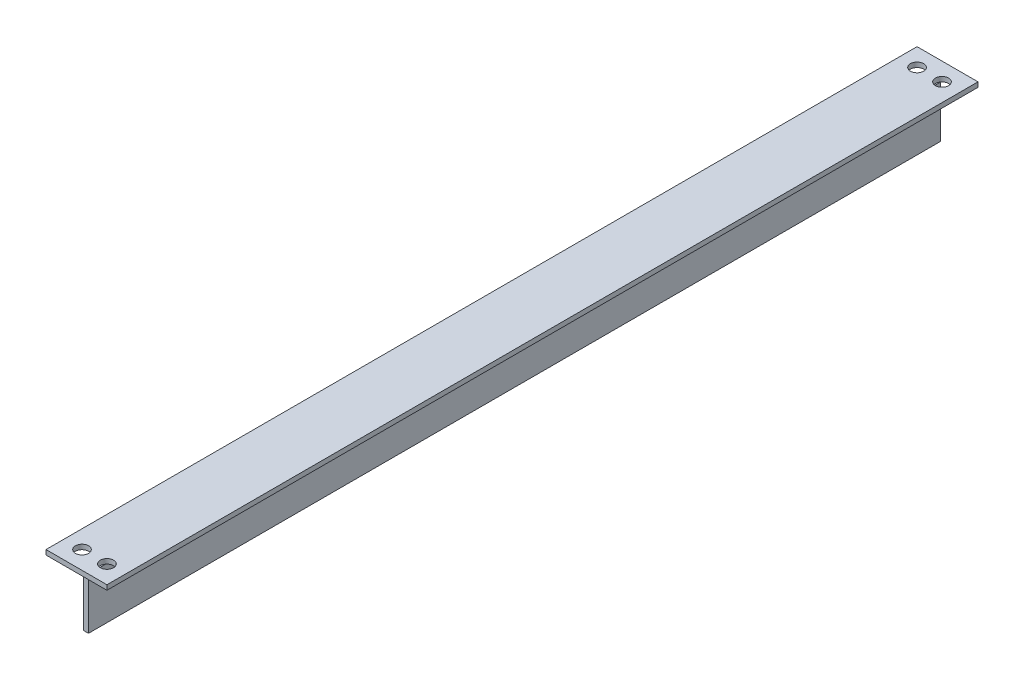
ISO-10303-21;
HEADER;
FILE_DESCRIPTION(('STEP AP214'),'2;1');
FILE_NAME('part.step','',(''),(''),'','','');
FILE_SCHEMA(('AUTOMOTIVE_DESIGN { 1 0 10303 214 1 1 1 1 }'));
ENDSEC;
DATA;
#1=APPLICATION_CONTEXT('core data for automotive mechanical design processes');
#2=APPLICATION_PROTOCOL_DEFINITION('international standard','automotive_design',2000,#1);
#3=PRODUCT_CONTEXT('',#1,'mechanical');
#4=PRODUCT('Part','Part','',(#3));
#5=PRODUCT_RELATED_PRODUCT_CATEGORY('part','',(#4));
#6=PRODUCT_DEFINITION_FORMATION('','',#4);
#7=PRODUCT_DEFINITION_CONTEXT('part definition',#1,'design');
#8=PRODUCT_DEFINITION('design','',#6,#7);
#9=PRODUCT_DEFINITION_SHAPE('','',#8);
#10=(LENGTH_UNIT() NAMED_UNIT(*) SI_UNIT(.MILLI.,.METRE.));
#11=(NAMED_UNIT(*) PLANE_ANGLE_UNIT() SI_UNIT($,.RADIAN.));
#12=(NAMED_UNIT(*) SI_UNIT($,.STERADIAN.) SOLID_ANGLE_UNIT());
#13=UNCERTAINTY_MEASURE_WITH_UNIT(LENGTH_MEASURE(1.E-05),#10,'distance_accuracy_value','');
#14=(GEOMETRIC_REPRESENTATION_CONTEXT(3) GLOBAL_UNCERTAINTY_ASSIGNED_CONTEXT((#13)) GLOBAL_UNIT_ASSIGNED_CONTEXT((#10,
#11,#12)) REPRESENTATION_CONTEXT('',''));
#15=CARTESIAN_POINT('',(0.,0.,0.));
#16=DIRECTION('',(0.,0.,1.));
#17=DIRECTION('',(1.,0.,0.));
#18=AXIS2_PLACEMENT_3D('',#15,#16,#17);
#19=CARTESIAN_POINT('',(-1.,-1.99999999999999,181.5));
#20=DIRECTION('',(1.,0.,0.));
#21=DIRECTION('',(0.,1.,0.));
#22=AXIS2_PLACEMENT_3D('',#19,#20,#21);
#23=PLANE('',#22);
#24=DIRECTION('',(0.,0.,-1.));
#25=VECTOR('',#24,1.);
#26=CARTESIAN_POINT('',(-1.,-3.99999999999999,181.5));
#27=LINE('',#26,#25);
#28=CARTESIAN_POINT('',(-1.,-3.99999999999999,177.5));
#29=VERTEX_POINT('',#28);
#30=CARTESIAN_POINT('',(-1.,-3.99999999999999,168.));
#31=VERTEX_POINT('',#30);
#32=EDGE_CURVE('E202',#29,#31,#27,.T.);
#33=ORIENTED_EDGE('',*,*,#32,.T.);
#34=DIRECTION('',(0.,1.,0.));
#35=VECTOR('',#34,1.);
#36=CARTESIAN_POINT('',(-1.,-1.99999999999999,168.));
#37=LINE('',#36,#35);
#38=CARTESIAN_POINT('',(-1.,-1.99999999999999,168.));
#39=VERTEX_POINT('',#38);
#40=EDGE_CURVE('E155',#31,#39,#37,.T.);
#41=ORIENTED_EDGE('',*,*,#40,.T.);
#42=DIRECTION('',(0.,0.,-1.));
#43=VECTOR('',#42,1.);
#44=CARTESIAN_POINT('',(-1.,-1.99999999999999,181.5));
#45=LINE('',#44,#43);
#46=CARTESIAN_POINT('',(-1.,-1.99999999999999,-168.));
#47=VERTEX_POINT('',#46);
#48=EDGE_CURVE('E149',#39,#47,#45,.T.);
#49=ORIENTED_EDGE('',*,*,#48,.T.);
#50=DIRECTION('',(0.,-1.,0.));
#51=VECTOR('',#50,1.);
#52=CARTESIAN_POINT('',(-1.,-1.99999999999999,-168.));
#53=LINE('',#52,#51);
#54=CARTESIAN_POINT('',(-1.,-3.99999999999999,-168.));
#55=VERTEX_POINT('',#54);
#56=EDGE_CURVE('E131',#47,#55,#53,.T.);
#57=ORIENTED_EDGE('',*,*,#56,.T.);
#58=DIRECTION('',(0.,0.,-1.));
#59=VECTOR('',#58,1.);
#60=CARTESIAN_POINT('',(-1.,-3.99999999999999,181.5));
#61=LINE('',#60,#59);
#62=CARTESIAN_POINT('',(-1.,-3.99999999999999,-177.5));
#63=VERTEX_POINT('',#62);
#64=EDGE_CURVE('E216',#55,#63,#61,.T.);
#65=ORIENTED_EDGE('',*,*,#64,.T.);
#66=DIRECTION('',(0.,-1.,0.));
#67=VECTOR('',#66,1.);
#68=CARTESIAN_POINT('',(-1.,-1.99999999999999,-177.5));
#69=LINE('',#68,#67);
#70=CARTESIAN_POINT('',(-0.999999999999994,-25.4,-177.5));
#71=VERTEX_POINT('',#70);
#72=EDGE_CURVE('E213',#63,#71,#69,.T.);
#73=ORIENTED_EDGE('',*,*,#72,.T.);
#74=DIRECTION('',(0.,0.,-1.));
#75=VECTOR('',#74,1.);
#76=CARTESIAN_POINT('',(-0.999999999999997,-25.4,181.5));
#77=LINE('',#76,#75);
#78=CARTESIAN_POINT('',(-0.999999999999994,-25.4,177.5));
#79=VERTEX_POINT('',#78);
#80=EDGE_CURVE('E157',#79,#71,#77,.T.);
#81=ORIENTED_EDGE('',*,*,#80,.F.);
#82=DIRECTION('',(0.,1.,0.));
#83=VECTOR('',#82,1.);
#84=CARTESIAN_POINT('',(-1.,-1.99999999999999,177.5));
#85=LINE('',#84,#83);
#86=EDGE_CURVE('E210',#79,#29,#85,.T.);
#87=ORIENTED_EDGE('',*,*,#86,.T.);
#88=EDGE_LOOP('',(#33,#41,#49,#57,#65,#73,#81,#87));
#89=FACE_BOUND('',#88,.T.);
#90=ADVANCED_FACE('F33',(#89),#23,.F.);
#91=CARTESIAN_POINT('',(-0.999999999999997,-25.4,181.5));
#92=DIRECTION('',(0.,1.,0.));
#93=DIRECTION('',(0.,0.,1.));
#94=AXIS2_PLACEMENT_3D('',#91,#92,#93);
#95=PLANE('',#94);
#96=DIRECTION('',(0.,0.,-1.));
#97=VECTOR('',#96,1.);
#98=CARTESIAN_POINT('',(0.999999999999997,-25.4,181.5));
#99=LINE('',#98,#97);
#100=CARTESIAN_POINT('',(0.999999999999994,-25.4,177.5));
#101=VERTEX_POINT('',#100);
#102=CARTESIAN_POINT('',(1.,-25.4,-177.5));
#103=VERTEX_POINT('',#102);
#104=EDGE_CURVE('E163',#101,#103,#99,.T.);
#105=ORIENTED_EDGE('',*,*,#104,.F.);
#106=DIRECTION('',(1.,0.,0.));
#107=VECTOR('',#106,1.);
#108=CARTESIAN_POINT('',(-50.,-25.4,177.5));
#109=LINE('',#108,#107);
#110=EDGE_CURVE('E182',#79,#101,#109,.T.);
#111=ORIENTED_EDGE('',*,*,#110,.F.);
#112=ORIENTED_EDGE('',*,*,#80,.T.);
#113=DIRECTION('',(1.,0.,0.));
#114=VECTOR('',#113,1.);
#115=CARTESIAN_POINT('',(-50.,-25.4,-177.5));
#116=LINE('',#115,#114);
#117=EDGE_CURVE('E184',#71,#103,#116,.T.);
#118=ORIENTED_EDGE('',*,*,#117,.T.);
#119=EDGE_LOOP('',(#105,#111,#112,#118));
#120=FACE_BOUND('',#119,.T.);
#121=ADVANCED_FACE('F181',(#120),#95,.F.);
#122=CARTESIAN_POINT('',(1.,-1.99999999999999,181.5));
#123=DIRECTION('',(-1.,0.,0.));
#124=DIRECTION('',(0.,-1.,0.));
#125=AXIS2_PLACEMENT_3D('',#122,#123,#124);
#126=PLANE('',#125);
#127=DIRECTION('',(0.,0.,-1.));
#128=VECTOR('',#127,1.);
#129=CARTESIAN_POINT('',(1.,-1.99999999999999,181.5));
#130=LINE('',#129,#128);
#131=CARTESIAN_POINT('',(1.,-1.99999999999999,168.));
#132=VERTEX_POINT('',#131);
#133=CARTESIAN_POINT('',(1.,-1.99999999999999,-168.));
#134=VERTEX_POINT('',#133);
#135=EDGE_CURVE('E151',#132,#134,#130,.T.);
#136=ORIENTED_EDGE('',*,*,#135,.F.);
#137=DIRECTION('',(0.,-1.,0.));
#138=VECTOR('',#137,1.);
#139=CARTESIAN_POINT('',(1.,-1.99999999999999,168.));
#140=LINE('',#139,#138);
#141=CARTESIAN_POINT('',(1.,-3.99999999999999,168.));
#142=VERTEX_POINT('',#141);
#143=EDGE_CURVE('E141',#132,#142,#140,.T.);
#144=ORIENTED_EDGE('',*,*,#143,.T.);
#145=DIRECTION('',(0.,0.,1.));
#146=VECTOR('',#145,1.);
#147=CARTESIAN_POINT('',(1.,-3.99999999999999,181.5));
#148=LINE('',#147,#146);
#149=CARTESIAN_POINT('',(1.,-3.99999999999999,177.5));
#150=VERTEX_POINT('',#149);
#151=EDGE_CURVE('E11',#142,#150,#148,.T.);
#152=ORIENTED_EDGE('',*,*,#151,.T.);
#153=DIRECTION('',(0.,-1.,0.));
#154=VECTOR('',#153,1.);
#155=CARTESIAN_POINT('',(1.,-1.99999999999999,177.5));
#156=LINE('',#155,#154);
#157=EDGE_CURVE('E42',#150,#101,#156,.T.);
#158=ORIENTED_EDGE('',*,*,#157,.T.);
#159=ORIENTED_EDGE('',*,*,#104,.T.);
#160=DIRECTION('',(0.,1.,0.));
#161=VECTOR('',#160,1.);
#162=CARTESIAN_POINT('',(1.,-1.99999999999999,-177.5));
#163=LINE('',#162,#161);
#164=CARTESIAN_POINT('',(1.,-3.99999999999999,-177.5));
#165=VERTEX_POINT('',#164);
#166=EDGE_CURVE('E160',#103,#165,#163,.T.);
#167=ORIENTED_EDGE('',*,*,#166,.T.);
#168=DIRECTION('',(0.,0.,1.));
#169=VECTOR('',#168,1.);
#170=CARTESIAN_POINT('',(1.,-3.99999999999999,181.5));
#171=LINE('',#170,#169);
#172=CARTESIAN_POINT('',(1.,-3.99999999999999,-168.));
#173=VERTEX_POINT('',#172);
#174=EDGE_CURVE('E156',#165,#173,#171,.T.);
#175=ORIENTED_EDGE('',*,*,#174,.T.);
#176=DIRECTION('',(0.,1.,0.));
#177=VECTOR('',#176,1.);
#178=CARTESIAN_POINT('',(1.,-1.99999999999999,-168.));
#179=LINE('',#178,#177);
#180=EDGE_CURVE('E142',#173,#134,#179,.T.);
#181=ORIENTED_EDGE('',*,*,#180,.T.);
#182=EDGE_LOOP('',(#136,#144,#152,#158,#159,#167,#175,#181));
#183=FACE_BOUND('',#182,.T.);
#184=ADVANCED_FACE('F173',(#183),#126,.F.);
#185=CARTESIAN_POINT('',(1.,-1.99999999999999,181.5));
#186=DIRECTION('',(0.,1.,0.));
#187=DIRECTION('',(-1.,0.,0.));
#188=AXIS2_PLACEMENT_3D('',#185,#186,#187);
#189=PLANE('',#188);
#190=CARTESIAN_POINT('',(5.2,-1.99999999999999,174.));
#191=DIRECTION('',(0.,1.,0.));
#192=DIRECTION('',(-1.,0.,0.));
#193=AXIS2_PLACEMENT_3D('',#190,#191,#192);
#194=CIRCLE('',#193,2.75);
#195=CARTESIAN_POINT('',(2.45,-1.99999999999999,174.));
#196=VERTEX_POINT('',#195);
#197=EDGE_CURVE('E249',#196,#196,#194,.T.);
#198=ORIENTED_EDGE('',*,*,#197,.T.);
#199=EDGE_LOOP('',(#198));
#200=FACE_BOUND('',#199,.T.);
#201=CARTESIAN_POINT('',(-5.19999999999991,-1.99999999999999,174.));
#202=DIRECTION('',(0.,1.,0.));
#203=DIRECTION('',(-1.,0.,0.));
#204=AXIS2_PLACEMENT_3D('',#201,#202,#203);
#205=CIRCLE('',#204,2.75);
#206=CARTESIAN_POINT('',(-7.94999999999991,-1.99999999999999,174.));
#207=VERTEX_POINT('',#206);
#208=EDGE_CURVE('E243',#207,#207,#205,.T.);
#209=ORIENTED_EDGE('',*,*,#208,.T.);
#210=EDGE_LOOP('',(#209));
#211=FACE_BOUND('',#210,.T.);
#212=CARTESIAN_POINT('',(-5.19999999999991,-1.99999999999999,-174.));
#213=DIRECTION('',(0.,1.,0.));
#214=DIRECTION('',(-1.,0.,0.));
#215=AXIS2_PLACEMENT_3D('',#212,#213,#214);
#216=CIRCLE('',#215,2.75);
#217=CARTESIAN_POINT('',(-7.94999999999991,-1.99999999999999,-174.));
#218=VERTEX_POINT('',#217);
#219=EDGE_CURVE('E237',#218,#218,#216,.T.);
#220=ORIENTED_EDGE('',*,*,#219,.T.);
#221=EDGE_LOOP('',(#220));
#222=FACE_BOUND('',#221,.T.);
#223=CARTESIAN_POINT('',(5.2,-1.99999999999999,-174.));
#224=DIRECTION('',(0.,1.,0.));
#225=DIRECTION('',(-1.,0.,0.));
#226=AXIS2_PLACEMENT_3D('',#223,#224,#225);
#227=CIRCLE('',#226,2.75);
#228=CARTESIAN_POINT('',(2.45,-1.99999999999999,-174.));
#229=VERTEX_POINT('',#228);
#230=EDGE_CURVE('E36',#229,#229,#227,.T.);
#231=ORIENTED_EDGE('',*,*,#230,.T.);
#232=EDGE_LOOP('',(#231));
#233=FACE_BOUND('',#232,.T.);
#234=DIRECTION('',(0.,0.,-1.));
#235=VECTOR('',#234,1.);
#236=CARTESIAN_POINT('',(-12.7,-1.99999999999999,181.5));
#237=LINE('',#236,#235);
#238=CARTESIAN_POINT('',(-12.7,-1.99999999999999,181.5));
#239=VERTEX_POINT('',#238);
#240=CARTESIAN_POINT('',(-12.7,-1.99999999999999,-181.5));
#241=VERTEX_POINT('',#240);
#242=EDGE_CURVE('E75',#239,#241,#237,.T.);
#243=ORIENTED_EDGE('',*,*,#242,.T.);
#244=DIRECTION('',(1.,0.,0.));
#245=VECTOR('',#244,1.);
#246=CARTESIAN_POINT('',(1.,-1.99999999999999,-181.5));
#247=LINE('',#246,#245);
#248=CARTESIAN_POINT('',(12.7,-1.99999999999999,-181.5));
#249=VERTEX_POINT('',#248);
#250=EDGE_CURVE('E200',#241,#249,#247,.T.);
#251=ORIENTED_EDGE('',*,*,#250,.T.);
#252=DIRECTION('',(0.,0.,-1.));
#253=VECTOR('',#252,1.);
#254=CARTESIAN_POINT('',(12.7,-1.99999999999999,181.5));
#255=LINE('',#254,#253);
#256=CARTESIAN_POINT('',(12.7,-1.99999999999999,181.5));
#257=VERTEX_POINT('',#256);
#258=EDGE_CURVE('E185',#257,#249,#255,.T.);
#259=ORIENTED_EDGE('',*,*,#258,.F.);
#260=DIRECTION('',(1.,0.,0.));
#261=VECTOR('',#260,1.);
#262=CARTESIAN_POINT('',(-1.,-1.99999999999999,181.5));
#263=LINE('',#262,#261);
#264=EDGE_CURVE('E79',#239,#257,#263,.T.);
#265=ORIENTED_EDGE('',*,*,#264,.F.);
#266=EDGE_LOOP('',(#243,#251,#259,#265));
#267=FACE_BOUND('',#266,.T.);
#268=ORIENTED_EDGE('',*,*,#48,.F.);
#269=DIRECTION('',(1.,0.,0.));
#270=VECTOR('',#269,1.);
#271=CARTESIAN_POINT('',(-50.,-1.99999999999999,168.));
#272=LINE('',#271,#270);
#273=EDGE_CURVE('E227',#39,#132,#272,.T.);
#274=ORIENTED_EDGE('',*,*,#273,.T.);
#275=ORIENTED_EDGE('',*,*,#135,.T.);
#276=DIRECTION('',(1.,0.,0.));
#277=VECTOR('',#276,1.);
#278=CARTESIAN_POINT('',(-50.,-1.99999999999999,-168.));
#279=LINE('',#278,#277);
#280=EDGE_CURVE('E134',#47,#134,#279,.T.);
#281=ORIENTED_EDGE('',*,*,#280,.F.);
#282=EDGE_LOOP('',(#268,#274,#275,#281));
#283=FACE_BOUND('',#282,.T.);
#284=ADVANCED_FACE('F147',(#200,#211,#222,#233,#267,#283),#189,.F.);
#285=CARTESIAN_POINT('',(12.7,-1.99999999999999,181.5));
#286=DIRECTION('',(-1.,0.,0.));
#287=DIRECTION('',(0.,0.,1.));
#288=AXIS2_PLACEMENT_3D('',#285,#286,#287);
#289=PLANE('',#288);
#290=DIRECTION('',(0.,1.,0.));
#291=VECTOR('',#290,1.);
#292=CARTESIAN_POINT('',(12.7,-1.99999999999999,-181.5));
#293=LINE('',#292,#291);
#294=CARTESIAN_POINT('',(12.7,0.,-181.5));
#295=VERTEX_POINT('',#294);
#296=EDGE_CURVE('E198',#249,#295,#293,.T.);
#297=ORIENTED_EDGE('',*,*,#296,.T.);
#298=DIRECTION('',(0.,0.,-1.));
#299=VECTOR('',#298,1.);
#300=CARTESIAN_POINT('',(12.7,0.,181.5));
#301=LINE('',#300,#299);
#302=CARTESIAN_POINT('',(12.7,0.,181.5));
#303=VERTEX_POINT('',#302);
#304=EDGE_CURVE('E189',#303,#295,#301,.T.);
#305=ORIENTED_EDGE('',*,*,#304,.F.);
#306=DIRECTION('',(0.,1.,0.));
#307=VECTOR('',#306,1.);
#308=CARTESIAN_POINT('',(12.7,-1.99999999999999,181.5));
#309=LINE('',#308,#307);
#310=EDGE_CURVE('E206',#257,#303,#309,.T.);
#311=ORIENTED_EDGE('',*,*,#310,.F.);
#312=ORIENTED_EDGE('',*,*,#258,.T.);
#313=EDGE_LOOP('',(#297,#305,#311,#312));
#314=FACE_BOUND('',#313,.T.);
#315=ADVANCED_FACE('F263',(#314),#289,.F.);
#316=CARTESIAN_POINT('',(-12.7,0.,181.5));
#317=DIRECTION('',(0.,-1.,0.));
#318=DIRECTION('',(0.,0.,-1.));
#319=AXIS2_PLACEMENT_3D('',#316,#317,#318);
#320=PLANE('',#319);
#321=CARTESIAN_POINT('',(5.2,0.,174.));
#322=DIRECTION('',(0.,1.,0.));
#323=DIRECTION('',(0.,0.,1.));
#324=AXIS2_PLACEMENT_3D('',#321,#322,#323);
#325=CIRCLE('',#324,2.75);
#326=CARTESIAN_POINT('',(5.2,0.,176.75));
#327=VERTEX_POINT('',#326);
#328=EDGE_CURVE('E252',#327,#327,#325,.T.);
#329=ORIENTED_EDGE('',*,*,#328,.F.);
#330=EDGE_LOOP('',(#329));
#331=FACE_BOUND('',#330,.T.);
#332=CARTESIAN_POINT('',(-5.19999999999991,0.,174.));
#333=DIRECTION('',(0.,1.,0.));
#334=DIRECTION('',(0.,0.,1.));
#335=AXIS2_PLACEMENT_3D('',#332,#333,#334);
#336=CIRCLE('',#335,2.75);
#337=CARTESIAN_POINT('',(-5.19999999999991,0.,176.75));
#338=VERTEX_POINT('',#337);
#339=EDGE_CURVE('E246',#338,#338,#336,.T.);
#340=ORIENTED_EDGE('',*,*,#339,.F.);
#341=EDGE_LOOP('',(#340));
#342=FACE_BOUND('',#341,.T.);
#343=CARTESIAN_POINT('',(-5.19999999999991,0.,-174.));
#344=DIRECTION('',(0.,1.,0.));
#345=DIRECTION('',(0.,0.,1.));
#346=AXIS2_PLACEMENT_3D('',#343,#344,#345);
#347=CIRCLE('',#346,2.75);
#348=CARTESIAN_POINT('',(-5.19999999999991,0.,-171.25));
#349=VERTEX_POINT('',#348);
#350=EDGE_CURVE('E240',#349,#349,#347,.T.);
#351=ORIENTED_EDGE('',*,*,#350,.F.);
#352=EDGE_LOOP('',(#351));
#353=FACE_BOUND('',#352,.T.);
#354=CARTESIAN_POINT('',(5.2,0.,-174.));
#355=DIRECTION('',(0.,1.,0.));
#356=DIRECTION('',(0.,0.,1.));
#357=AXIS2_PLACEMENT_3D('',#354,#355,#356);
#358=CIRCLE('',#357,2.75);
#359=CARTESIAN_POINT('',(5.2,0.,-171.25));
#360=VERTEX_POINT('',#359);
#361=EDGE_CURVE('E234',#360,#360,#358,.T.);
#362=ORIENTED_EDGE('',*,*,#361,.F.);
#363=EDGE_LOOP('',(#362));
#364=FACE_BOUND('',#363,.T.);
#365=DIRECTION('',(-1.,0.,0.));
#366=VECTOR('',#365,1.);
#367=CARTESIAN_POINT('',(-12.7,0.,-181.5));
#368=LINE('',#367,#366);
#369=CARTESIAN_POINT('',(-12.7,0.,-181.5));
#370=VERTEX_POINT('',#369);
#371=EDGE_CURVE('E68',#295,#370,#368,.T.);
#372=ORIENTED_EDGE('',*,*,#371,.T.);
#373=DIRECTION('',(0.,0.,-1.));
#374=VECTOR('',#373,1.);
#375=CARTESIAN_POINT('',(-12.7,0.,181.5));
#376=LINE('',#375,#374);
#377=CARTESIAN_POINT('',(-12.7,0.,181.5));
#378=VERTEX_POINT('',#377);
#379=EDGE_CURVE('E191',#378,#370,#376,.T.);
#380=ORIENTED_EDGE('',*,*,#379,.F.);
#381=DIRECTION('',(-1.,0.,0.));
#382=VECTOR('',#381,1.);
#383=CARTESIAN_POINT('',(-12.7,0.,181.5));
#384=LINE('',#383,#382);
#385=EDGE_CURVE('E204',#303,#378,#384,.T.);
#386=ORIENTED_EDGE('',*,*,#385,.F.);
#387=ORIENTED_EDGE('',*,*,#304,.T.);
#388=EDGE_LOOP('',(#372,#380,#386,#387));
#389=FACE_BOUND('',#388,.T.);
#390=ADVANCED_FACE('F259',(#331,#342,#353,#364,#389),#320,.F.);
#391=CARTESIAN_POINT('',(-12.7,-1.99999999999999,181.5));
#392=DIRECTION('',(1.,0.,0.));
#393=DIRECTION('',(0.,0.,-1.));
#394=AXIS2_PLACEMENT_3D('',#391,#392,#393);
#395=PLANE('',#394);
#396=DIRECTION('',(0.,-1.,0.));
#397=VECTOR('',#396,1.);
#398=CARTESIAN_POINT('',(-12.7,-1.99999999999999,-181.5));
#399=LINE('',#398,#397);
#400=EDGE_CURVE('E194',#370,#241,#399,.T.);
#401=ORIENTED_EDGE('',*,*,#400,.T.);
#402=ORIENTED_EDGE('',*,*,#242,.F.);
#403=DIRECTION('',(0.,-1.,0.));
#404=VECTOR('',#403,1.);
#405=CARTESIAN_POINT('',(-12.7,-1.99999999999999,181.5));
#406=LINE('',#405,#404);
#407=EDGE_CURVE('E50',#378,#239,#406,.T.);
#408=ORIENTED_EDGE('',*,*,#407,.F.);
#409=ORIENTED_EDGE('',*,*,#379,.T.);
#410=EDGE_LOOP('',(#401,#402,#408,#409));
#411=FACE_BOUND('',#410,.T.);
#412=ADVANCED_FACE('F262',(#411),#395,.F.);
#413=CARTESIAN_POINT('',(0.,0.,181.5));
#414=DIRECTION('',(0.,0.,-1.));
#415=DIRECTION('',(-1.,0.,0.));
#416=AXIS2_PLACEMENT_3D('',#413,#414,#415);
#417=PLANE('',#416);
#418=ORIENTED_EDGE('',*,*,#264,.T.);
#419=ORIENTED_EDGE('',*,*,#310,.T.);
#420=ORIENTED_EDGE('',*,*,#385,.T.);
#421=ORIENTED_EDGE('',*,*,#407,.T.);
#422=EDGE_LOOP('',(#418,#419,#420,#421));
#423=FACE_BOUND('',#422,.T.);
#424=ADVANCED_FACE('F318',(#423),#417,.F.);
#425=CARTESIAN_POINT('',(0.,0.,-181.5));
#426=DIRECTION('',(0.,0.,-1.));
#427=DIRECTION('',(-1.,0.,0.));
#428=AXIS2_PLACEMENT_3D('',#425,#426,#427);
#429=PLANE('',#428);
#430=ORIENTED_EDGE('',*,*,#250,.F.);
#431=ORIENTED_EDGE('',*,*,#400,.F.);
#432=ORIENTED_EDGE('',*,*,#371,.F.);
#433=ORIENTED_EDGE('',*,*,#296,.F.);
#434=EDGE_LOOP('',(#430,#431,#432,#433));
#435=FACE_BOUND('',#434,.T.);
#436=ADVANCED_FACE('F328',(#435),#429,.T.);
#437=CARTESIAN_POINT('',(-50.,-3.99999999999999,-177.5));
#438=DIRECTION('',(0.,0.,1.));
#439=DIRECTION('',(1.,0.,0.));
#440=AXIS2_PLACEMENT_3D('',#437,#438,#439);
#441=PLANE('',#440);
#442=DIRECTION('',(1.,0.,0.));
#443=VECTOR('',#442,1.);
#444=CARTESIAN_POINT('',(-50.,-3.99999999999999,-177.5));
#445=LINE('',#444,#443);
#446=EDGE_CURVE('E223',#63,#165,#445,.T.);
#447=ORIENTED_EDGE('',*,*,#446,.T.);
#448=ORIENTED_EDGE('',*,*,#166,.F.);
#449=ORIENTED_EDGE('',*,*,#117,.F.);
#450=ORIENTED_EDGE('',*,*,#72,.F.);
#451=EDGE_LOOP('',(#447,#448,#449,#450));
#452=FACE_BOUND('',#451,.T.);
#453=ADVANCED_FACE('F337',(#452),#441,.F.);
#454=CARTESIAN_POINT('',(-50.,-3.99999999999999,-177.5));
#455=DIRECTION('',(0.,-1.,0.));
#456=DIRECTION('',(0.,0.,-1.));
#457=AXIS2_PLACEMENT_3D('',#454,#455,#456);
#458=PLANE('',#457);
#459=DIRECTION('',(1.,0.,0.));
#460=VECTOR('',#459,1.);
#461=CARTESIAN_POINT('',(-50.,-3.99999999999999,-168.));
#462=LINE('',#461,#460);
#463=EDGE_CURVE('E137',#55,#173,#462,.T.);
#464=ORIENTED_EDGE('',*,*,#463,.T.);
#465=ORIENTED_EDGE('',*,*,#174,.F.);
#466=ORIENTED_EDGE('',*,*,#446,.F.);
#467=ORIENTED_EDGE('',*,*,#64,.F.);
#468=EDGE_LOOP('',(#464,#465,#466,#467));
#469=FACE_BOUND('',#468,.T.);
#470=ADVANCED_FACE('F348',(#469),#458,.F.);
#471=CARTESIAN_POINT('',(-50.,-3.99999999999999,-168.));
#472=DIRECTION('',(0.,0.,1.));
#473=DIRECTION('',(1.,0.,0.));
#474=AXIS2_PLACEMENT_3D('',#471,#472,#473);
#475=PLANE('',#474);
#476=ORIENTED_EDGE('',*,*,#280,.T.);
#477=ORIENTED_EDGE('',*,*,#180,.F.);
#478=ORIENTED_EDGE('',*,*,#463,.F.);
#479=ORIENTED_EDGE('',*,*,#56,.F.);
#480=EDGE_LOOP('',(#476,#477,#478,#479));
#481=FACE_BOUND('',#480,.T.);
#482=ADVANCED_FACE('F133',(#481),#475,.F.);
#483=CARTESIAN_POINT('',(-50.,-3.99999999999999,177.5));
#484=DIRECTION('',(0.,-1.,0.));
#485=DIRECTION('',(0.,0.,-1.));
#486=AXIS2_PLACEMENT_3D('',#483,#484,#485);
#487=PLANE('',#486);
#488=DIRECTION('',(1.,0.,0.));
#489=VECTOR('',#488,1.);
#490=CARTESIAN_POINT('',(-50.,-3.99999999999999,177.5));
#491=LINE('',#490,#489);
#492=EDGE_CURVE('E230',#29,#150,#491,.T.);
#493=ORIENTED_EDGE('',*,*,#492,.T.);
#494=ORIENTED_EDGE('',*,*,#151,.F.);
#495=DIRECTION('',(1.,0.,0.));
#496=VECTOR('',#495,1.);
#497=CARTESIAN_POINT('',(-50.,-3.99999999999999,168.));
#498=LINE('',#497,#496);
#499=EDGE_CURVE('E220',#31,#142,#498,.T.);
#500=ORIENTED_EDGE('',*,*,#499,.F.);
#501=ORIENTED_EDGE('',*,*,#32,.F.);
#502=EDGE_LOOP('',(#493,#494,#500,#501));
#503=FACE_BOUND('',#502,.T.);
#504=ADVANCED_FACE('F368',(#503),#487,.F.);
#505=CARTESIAN_POINT('',(-50.,-3.99999999999999,177.5));
#506=DIRECTION('',(0.,0.,-1.));
#507=DIRECTION('',(-1.,0.,0.));
#508=AXIS2_PLACEMENT_3D('',#505,#506,#507);
#509=PLANE('',#508);
#510=ORIENTED_EDGE('',*,*,#110,.T.);
#511=ORIENTED_EDGE('',*,*,#157,.F.);
#512=ORIENTED_EDGE('',*,*,#492,.F.);
#513=ORIENTED_EDGE('',*,*,#86,.F.);
#514=EDGE_LOOP('',(#510,#511,#512,#513));
#515=FACE_BOUND('',#514,.T.);
#516=ADVANCED_FACE('F377',(#515),#509,.F.);
#517=CARTESIAN_POINT('',(-50.,-3.99999999999999,168.));
#518=DIRECTION('',(0.,0.,-1.));
#519=DIRECTION('',(-1.,0.,0.));
#520=AXIS2_PLACEMENT_3D('',#517,#518,#519);
#521=PLANE('',#520);
#522=ORIENTED_EDGE('',*,*,#499,.T.);
#523=ORIENTED_EDGE('',*,*,#143,.F.);
#524=ORIENTED_EDGE('',*,*,#273,.F.);
#525=ORIENTED_EDGE('',*,*,#40,.F.);
#526=EDGE_LOOP('',(#522,#523,#524,#525));
#527=FACE_BOUND('',#526,.T.);
#528=ADVANCED_FACE('F275',(#527),#521,.F.);
#529=CARTESIAN_POINT('',(5.2,0.,-174.));
#530=DIRECTION('',(0.,1.,0.));
#531=DIRECTION('',(0.,0.,1.));
#532=AXIS2_PLACEMENT_3D('',#529,#530,#531);
#533=CYLINDRICAL_SURFACE('',#532,2.75);
#534=ORIENTED_EDGE('',*,*,#361,.T.);
#535=EDGE_LOOP('',(#534));
#536=FACE_BOUND('',#535,.T.);
#537=ORIENTED_EDGE('',*,*,#230,.F.);
#538=EDGE_LOOP('',(#537));
#539=FACE_BOUND('',#538,.T.);
#540=ADVANCED_FACE('F271',(#536,#539),#533,.F.);
#541=CARTESIAN_POINT('',(-5.19999999999991,0.,-174.));
#542=DIRECTION('',(0.,1.,0.));
#543=DIRECTION('',(0.,0.,1.));
#544=AXIS2_PLACEMENT_3D('',#541,#542,#543);
#545=CYLINDRICAL_SURFACE('',#544,2.75);
#546=ORIENTED_EDGE('',*,*,#350,.T.);
#547=EDGE_LOOP('',(#546));
#548=FACE_BOUND('',#547,.T.);
#549=ORIENTED_EDGE('',*,*,#219,.F.);
#550=EDGE_LOOP('',(#549));
#551=FACE_BOUND('',#550,.T.);
#552=ADVANCED_FACE('F274',(#548,#551),#545,.F.);
#553=CARTESIAN_POINT('',(-5.19999999999991,0.,174.));
#554=DIRECTION('',(0.,1.,0.));
#555=DIRECTION('',(0.,0.,1.));
#556=AXIS2_PLACEMENT_3D('',#553,#554,#555);
#557=CYLINDRICAL_SURFACE('',#556,2.75);
#558=ORIENTED_EDGE('',*,*,#339,.T.);
#559=EDGE_LOOP('',(#558));
#560=FACE_BOUND('',#559,.T.);
#561=ORIENTED_EDGE('',*,*,#208,.F.);
#562=EDGE_LOOP('',(#561));
#563=FACE_BOUND('',#562,.T.);
#564=ADVANCED_FACE('F419',(#560,#563),#557,.F.);
#565=CARTESIAN_POINT('',(5.2,0.,174.));
#566=DIRECTION('',(0.,1.,0.));
#567=DIRECTION('',(0.,0.,1.));
#568=AXIS2_PLACEMENT_3D('',#565,#566,#567);
#569=CYLINDRICAL_SURFACE('',#568,2.75);
#570=ORIENTED_EDGE('',*,*,#328,.T.);
#571=EDGE_LOOP('',(#570));
#572=FACE_BOUND('',#571,.T.);
#573=ORIENTED_EDGE('',*,*,#197,.F.);
#574=EDGE_LOOP('',(#573));
#575=FACE_BOUND('',#574,.T.);
#576=ADVANCED_FACE('F256',(#572,#575),#569,.F.);
#577=CLOSED_SHELL('',(#90,#121,#184,#284,#315,#390,#412,#424,#436,#453,#470,#482,#504,#516,#528,
#540,#552,#564,#576));
#578=MANIFOLD_SOLID_BREP('B2',#577);
#579=ADVANCED_BREP_SHAPE_REPRESENTATION('',(#18,#578),#14);
#580=SHAPE_DEFINITION_REPRESENTATION(#9,#579);
ENDSEC;
END-ISO-10303-21;
